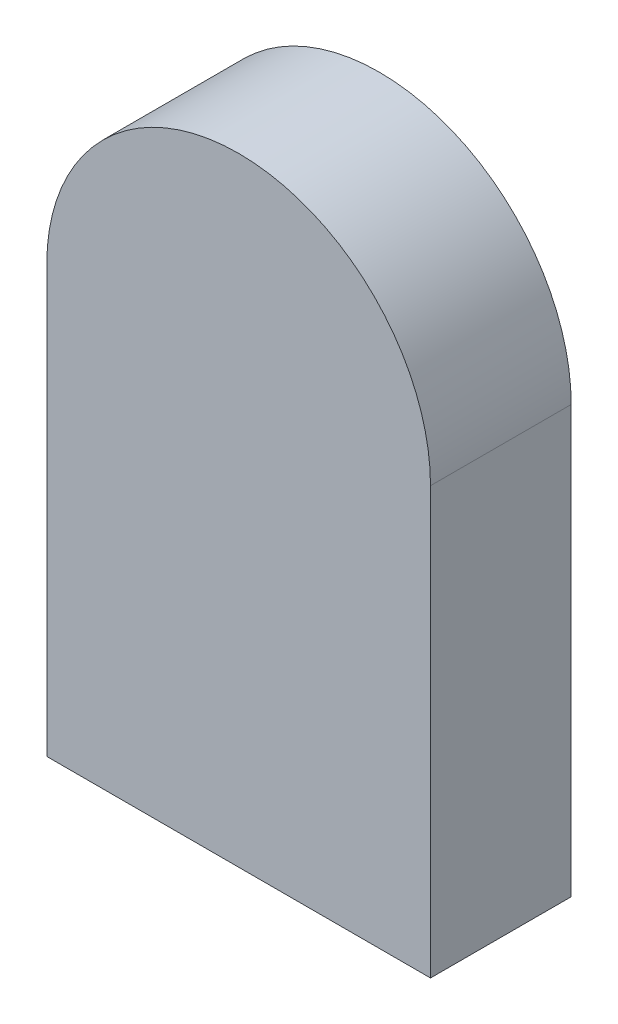
ISO-10303-21;
HEADER;
FILE_DESCRIPTION(('STEP AP214'),'2;1');
FILE_NAME('part.step','',(''),(''),'','','');
FILE_SCHEMA(('AUTOMOTIVE_DESIGN { 1 0 10303 214 1 1 1 1 }'));
ENDSEC;
DATA;
#1=APPLICATION_CONTEXT('core data for automotive mechanical design processes');
#2=APPLICATION_PROTOCOL_DEFINITION('international standard','automotive_design',2000,#1);
#3=PRODUCT_CONTEXT('',#1,'mechanical');
#4=PRODUCT('Part','Part','',(#3));
#5=PRODUCT_RELATED_PRODUCT_CATEGORY('part','',(#4));
#6=PRODUCT_DEFINITION_FORMATION('','',#4);
#7=PRODUCT_DEFINITION_CONTEXT('part definition',#1,'design');
#8=PRODUCT_DEFINITION('design','',#6,#7);
#9=PRODUCT_DEFINITION_SHAPE('','',#8);
#10=(LENGTH_UNIT() NAMED_UNIT(*) SI_UNIT(.MILLI.,.METRE.));
#11=(NAMED_UNIT(*) PLANE_ANGLE_UNIT() SI_UNIT($,.RADIAN.));
#12=(NAMED_UNIT(*) SI_UNIT($,.STERADIAN.) SOLID_ANGLE_UNIT());
#13=UNCERTAINTY_MEASURE_WITH_UNIT(LENGTH_MEASURE(1.E-05),#10,'distance_accuracy_value','');
#14=(GEOMETRIC_REPRESENTATION_CONTEXT(3) GLOBAL_UNCERTAINTY_ASSIGNED_CONTEXT((#13)) GLOBAL_UNIT_ASSIGNED_CONTEXT((#10,
#11,#12)) REPRESENTATION_CONTEXT('',''));
#15=CARTESIAN_POINT('',(0.,0.,0.));
#16=DIRECTION('',(0.,0.,1.));
#17=DIRECTION('',(1.,0.,0.));
#18=AXIS2_PLACEMENT_3D('',#15,#16,#17);
#19=CARTESIAN_POINT('',(-11.43,0.,8.382));
#20=DIRECTION('',(1.,0.,0.));
#21=DIRECTION('',(0.,0.,-1.));
#22=AXIS2_PLACEMENT_3D('',#19,#20,#21);
#23=PLANE('',#22);
#24=DIRECTION('',(0.,-1.,0.));
#25=VECTOR('',#24,1.);
#26=CARTESIAN_POINT('',(-11.43,0.,0.));
#27=LINE('',#26,#25);
#28=CARTESIAN_POINT('',(-11.43,0.,0.));
#29=VERTEX_POINT('',#28);
#30=CARTESIAN_POINT('',(-11.43,-25.4,0.));
#31=VERTEX_POINT('',#30);
#32=EDGE_CURVE('E107',#29,#31,#27,.T.);
#33=ORIENTED_EDGE('',*,*,#32,.T.);
#34=DIRECTION('',(0.,0.,-1.));
#35=VECTOR('',#34,1.);
#36=CARTESIAN_POINT('',(-11.43,-25.4,8.382));
#37=LINE('',#36,#35);
#38=CARTESIAN_POINT('',(-11.43,-25.4,8.382));
#39=VERTEX_POINT('',#38);
#40=EDGE_CURVE('E11',#39,#31,#37,.T.);
#41=ORIENTED_EDGE('',*,*,#40,.F.);
#42=DIRECTION('',(0.,-1.,0.));
#43=VECTOR('',#42,1.);
#44=CARTESIAN_POINT('',(-11.43,0.,8.382));
#45=LINE('',#44,#43);
#46=CARTESIAN_POINT('',(-11.43,0.,8.382));
#47=VERTEX_POINT('',#46);
#48=EDGE_CURVE('E91',#47,#39,#45,.T.);
#49=ORIENTED_EDGE('',*,*,#48,.F.);
#50=DIRECTION('',(0.,0.,-1.));
#51=VECTOR('',#50,1.);
#52=CARTESIAN_POINT('',(-11.43,0.,8.382));
#53=LINE('',#52,#51);
#54=EDGE_CURVE('E103',#47,#29,#53,.T.);
#55=ORIENTED_EDGE('',*,*,#54,.T.);
#56=EDGE_LOOP('',(#33,#41,#49,#55));
#57=FACE_BOUND('',#56,.T.);
#58=ADVANCED_FACE('F39',(#57),#23,.F.);
#59=CARTESIAN_POINT('',(-11.43,-25.4,8.382));
#60=DIRECTION('',(0.,1.,0.));
#61=DIRECTION('',(0.,0.,1.));
#62=AXIS2_PLACEMENT_3D('',#59,#60,#61);
#63=PLANE('',#62);
#64=DIRECTION('',(1.,0.,0.));
#65=VECTOR('',#64,1.);
#66=CARTESIAN_POINT('',(-11.43,-25.4,0.));
#67=LINE('',#66,#65);
#68=CARTESIAN_POINT('',(11.43,-25.4,0.));
#69=VERTEX_POINT('',#68);
#70=EDGE_CURVE('E96',#31,#69,#67,.T.);
#71=ORIENTED_EDGE('',*,*,#70,.T.);
#72=DIRECTION('',(0.,0.,-1.));
#73=VECTOR('',#72,1.);
#74=CARTESIAN_POINT('',(11.43,-25.4,8.382));
#75=LINE('',#74,#73);
#76=CARTESIAN_POINT('',(11.43,-25.4,8.382));
#77=VERTEX_POINT('',#76);
#78=EDGE_CURVE('E48',#77,#69,#75,.T.);
#79=ORIENTED_EDGE('',*,*,#78,.F.);
#80=DIRECTION('',(1.,0.,0.));
#81=VECTOR('',#80,1.);
#82=CARTESIAN_POINT('',(-11.43,-25.4,8.382));
#83=LINE('',#82,#81);
#84=EDGE_CURVE('E86',#39,#77,#83,.T.);
#85=ORIENTED_EDGE('',*,*,#84,.F.);
#86=ORIENTED_EDGE('',*,*,#40,.T.);
#87=EDGE_LOOP('',(#71,#79,#85,#86));
#88=FACE_BOUND('',#87,.T.);
#89=ADVANCED_FACE('F95',(#88),#63,.F.);
#90=CARTESIAN_POINT('',(11.43,0.,8.382));
#91=DIRECTION('',(-1.,0.,0.));
#92=DIRECTION('',(0.,-1.,0.));
#93=AXIS2_PLACEMENT_3D('',#90,#91,#92);
#94=PLANE('',#93);
#95=DIRECTION('',(0.,1.,0.));
#96=VECTOR('',#95,1.);
#97=CARTESIAN_POINT('',(11.43,0.,0.));
#98=LINE('',#97,#96);
#99=CARTESIAN_POINT('',(11.43,0.,0.));
#100=VERTEX_POINT('',#99);
#101=EDGE_CURVE('E73',#69,#100,#98,.T.);
#102=ORIENTED_EDGE('',*,*,#101,.T.);
#103=DIRECTION('',(0.,0.,-1.));
#104=VECTOR('',#103,1.);
#105=CARTESIAN_POINT('',(11.43,0.,8.382));
#106=LINE('',#105,#104);
#107=CARTESIAN_POINT('',(11.43,0.,8.382));
#108=VERTEX_POINT('',#107);
#109=EDGE_CURVE('E98',#108,#100,#106,.T.);
#110=ORIENTED_EDGE('',*,*,#109,.F.);
#111=DIRECTION('',(0.,1.,0.));
#112=VECTOR('',#111,1.);
#113=CARTESIAN_POINT('',(11.43,0.,8.382));
#114=LINE('',#113,#112);
#115=EDGE_CURVE('E89',#77,#108,#114,.T.);
#116=ORIENTED_EDGE('',*,*,#115,.F.);
#117=ORIENTED_EDGE('',*,*,#78,.T.);
#118=EDGE_LOOP('',(#102,#110,#116,#117));
#119=FACE_BOUND('',#118,.T.);
#120=ADVANCED_FACE('F99',(#119),#94,.F.);
#121=CARTESIAN_POINT('',(0.,0.,8.382));
#122=DIRECTION('',(0.,0.,-1.));
#123=DIRECTION('',(-1.,0.,0.));
#124=AXIS2_PLACEMENT_3D('',#121,#122,#123);
#125=CYLINDRICAL_SURFACE('',#124,11.43);
#126=CARTESIAN_POINT('',(0.,0.,0.));
#127=DIRECTION('',(0.,0.,1.));
#128=DIRECTION('',(1.,0.,0.));
#129=AXIS2_PLACEMENT_3D('',#126,#127,#128);
#130=CIRCLE('',#129,11.43);
#131=EDGE_CURVE('E79',#100,#29,#130,.T.);
#132=ORIENTED_EDGE('',*,*,#131,.T.);
#133=ORIENTED_EDGE('',*,*,#54,.F.);
#134=CARTESIAN_POINT('',(0.,0.,8.382));
#135=DIRECTION('',(0.,0.,1.));
#136=DIRECTION('',(1.,0.,0.));
#137=AXIS2_PLACEMENT_3D('',#134,#135,#136);
#138=CIRCLE('',#137,11.43);
#139=EDGE_CURVE('E56',#108,#47,#138,.T.);
#140=ORIENTED_EDGE('',*,*,#139,.F.);
#141=ORIENTED_EDGE('',*,*,#109,.T.);
#142=EDGE_LOOP('',(#132,#133,#140,#141));
#143=FACE_BOUND('',#142,.T.);
#144=ADVANCED_FACE('F120',(#143),#125,.T.);
#145=CARTESIAN_POINT('',(0.,0.,8.382));
#146=DIRECTION('',(0.,0.,1.));
#147=DIRECTION('',(1.,0.,0.));
#148=AXIS2_PLACEMENT_3D('',#145,#146,#147);
#149=PLANE('',#148);
#150=ORIENTED_EDGE('',*,*,#48,.T.);
#151=ORIENTED_EDGE('',*,*,#84,.T.);
#152=ORIENTED_EDGE('',*,*,#115,.T.);
#153=ORIENTED_EDGE('',*,*,#139,.T.);
#154=EDGE_LOOP('',(#150,#151,#152,#153));
#155=FACE_BOUND('',#154,.T.);
#156=ADVANCED_FACE('F87',(#155),#149,.T.);
#157=CARTESIAN_POINT('',(0.,0.,0.));
#158=DIRECTION('',(0.,0.,1.));
#159=DIRECTION('',(1.,0.,0.));
#160=AXIS2_PLACEMENT_3D('',#157,#158,#159);
#161=PLANE('',#160);
#162=ORIENTED_EDGE('',*,*,#32,.F.);
#163=ORIENTED_EDGE('',*,*,#131,.F.);
#164=ORIENTED_EDGE('',*,*,#101,.F.);
#165=ORIENTED_EDGE('',*,*,#70,.F.);
#166=EDGE_LOOP('',(#162,#163,#164,#165));
#167=FACE_BOUND('',#166,.T.);
#168=ADVANCED_FACE('F123',(#167),#161,.F.);
#169=CLOSED_SHELL('',(#58,#89,#120,#144,#156,#168));
#170=MANIFOLD_SOLID_BREP('B2',#169);
#171=ADVANCED_BREP_SHAPE_REPRESENTATION('',(#18,#170),#14);
#172=SHAPE_DEFINITION_REPRESENTATION(#9,#171);
ENDSEC;
END-ISO-10303-21;
